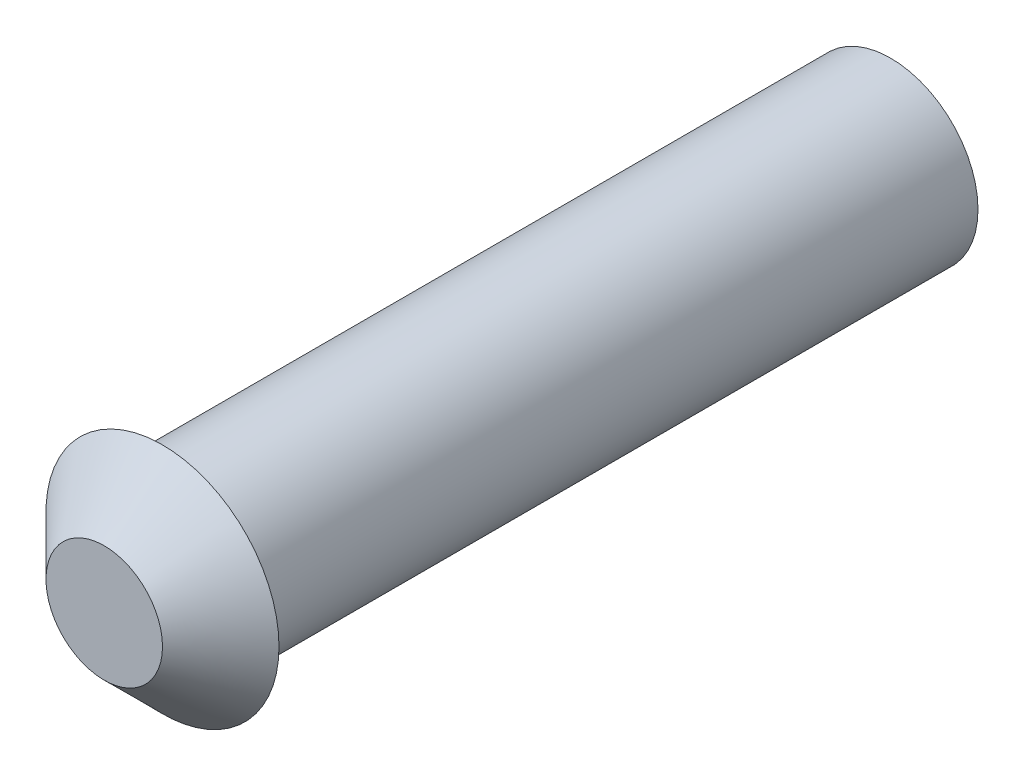
ISO-10303-21;
HEADER;
FILE_DESCRIPTION(('STEP AP214'),'2;1');
FILE_NAME('part.step','',(''),(''),'','','');
FILE_SCHEMA(('AUTOMOTIVE_DESIGN { 1 0 10303 214 1 1 1 1 }'));
ENDSEC;
DATA;
#1=APPLICATION_CONTEXT('core data for automotive mechanical design processes');
#2=APPLICATION_PROTOCOL_DEFINITION('international standard','automotive_design',2000,#1);
#3=PRODUCT_CONTEXT('',#1,'mechanical');
#4=PRODUCT('Part','Part','',(#3));
#5=PRODUCT_RELATED_PRODUCT_CATEGORY('part','',(#4));
#6=PRODUCT_DEFINITION_FORMATION('','',#4);
#7=PRODUCT_DEFINITION_CONTEXT('part definition',#1,'design');
#8=PRODUCT_DEFINITION('design','',#6,#7);
#9=PRODUCT_DEFINITION_SHAPE('','',#8);
#10=(LENGTH_UNIT() NAMED_UNIT(*) SI_UNIT(.MILLI.,.METRE.));
#11=(NAMED_UNIT(*) PLANE_ANGLE_UNIT() SI_UNIT($,.RADIAN.));
#12=(NAMED_UNIT(*) SI_UNIT($,.STERADIAN.) SOLID_ANGLE_UNIT());
#13=UNCERTAINTY_MEASURE_WITH_UNIT(LENGTH_MEASURE(1.E-05),#10,'distance_accuracy_value','');
#14=(GEOMETRIC_REPRESENTATION_CONTEXT(3) GLOBAL_UNCERTAINTY_ASSIGNED_CONTEXT((#13)) GLOBAL_UNIT_ASSIGNED_CONTEXT((#10,
#11,#12)) REPRESENTATION_CONTEXT('',''));
#15=CARTESIAN_POINT('',(0.,0.,0.));
#16=DIRECTION('',(0.,0.,1.));
#17=DIRECTION('',(1.,0.,0.));
#18=AXIS2_PLACEMENT_3D('',#15,#16,#17);
#19=CARTESIAN_POINT('',(0.,0.,7.9375));
#20=DIRECTION('',(0.,0.,-1.));
#21=DIRECTION('',(-1.,0.,0.));
#22=AXIS2_PLACEMENT_3D('',#19,#20,#21);
#23=CYLINDRICAL_SURFACE('',#22,1.905);
#24=CARTESIAN_POINT('',(0.,0.,7.9375));
#25=DIRECTION('',(0.,0.,1.));
#26=DIRECTION('',(1.,0.,0.));
#27=AXIS2_PLACEMENT_3D('',#24,#25,#26);
#28=CIRCLE('',#27,1.905);
#29=CARTESIAN_POINT('',(1.905,0.,7.9375));
#30=VERTEX_POINT('',#29);
#31=EDGE_CURVE('E11',#30,#30,#28,.T.);
#32=ORIENTED_EDGE('',*,*,#31,.F.);
#33=EDGE_LOOP('',(#32));
#34=FACE_BOUND('',#33,.T.);
#35=CARTESIAN_POINT('',(0.,0.,-7.9375));
#36=DIRECTION('',(0.,0.,1.));
#37=DIRECTION('',(1.,0.,0.));
#38=AXIS2_PLACEMENT_3D('',#35,#36,#37);
#39=CIRCLE('',#38,1.905);
#40=CARTESIAN_POINT('',(1.905,0.,-7.9375));
#41=VERTEX_POINT('',#40);
#42=EDGE_CURVE('E45',#41,#41,#39,.T.);
#43=ORIENTED_EDGE('',*,*,#42,.T.);
#44=EDGE_LOOP('',(#43));
#45=FACE_BOUND('',#44,.T.);
#46=ADVANCED_FACE('F42',(#34,#45),#23,.T.);
#47=CARTESIAN_POINT('',(0.,0.,-7.9375));
#48=DIRECTION('',(0.,0.,1.));
#49=DIRECTION('',(1.,0.,0.));
#50=AXIS2_PLACEMENT_3D('',#47,#48,#49);
#51=PLANE('',#50);
#52=ORIENTED_EDGE('',*,*,#42,.F.);
#53=EDGE_LOOP('',(#52));
#54=FACE_BOUND('',#53,.T.);
#55=ADVANCED_FACE('F74',(#54),#51,.F.);
#56=CARTESIAN_POINT('',(0.,0.,9.2075));
#57=DIRECTION('',(0.,0.,1.));
#58=DIRECTION('',(1.,0.,0.));
#59=AXIS2_PLACEMENT_3D('',#56,#57,#58);
#60=PLANE('',#59);
#61=CARTESIAN_POINT('',(0.,0.,9.2075));
#62=DIRECTION('',(0.,0.,1.));
#63=DIRECTION('',(1.,0.,0.));
#64=AXIS2_PLACEMENT_3D('',#61,#62,#63);
#65=CIRCLE('',#64,1.27);
#66=CARTESIAN_POINT('',(1.27,0.,9.2075));
#67=VERTEX_POINT('',#66);
#68=EDGE_CURVE('E52',#67,#67,#65,.T.);
#69=ORIENTED_EDGE('',*,*,#68,.T.);
#70=EDGE_LOOP('',(#69));
#71=FACE_BOUND('',#70,.T.);
#72=ADVANCED_FACE('F64',(#71),#60,.T.);
#73=CARTESIAN_POINT('',(0.,0.,7.9375));
#74=DIRECTION('',(0.,0.,1.));
#75=DIRECTION('',(1.,0.,0.));
#76=AXIS2_PLACEMENT_3D('',#73,#74,#75);
#77=PLANE('',#76);
#78=ORIENTED_EDGE('',*,*,#31,.T.);
#79=EDGE_LOOP('',(#78));
#80=FACE_BOUND('',#79,.T.);
#81=CARTESIAN_POINT('',(0.,0.,7.9375));
#82=DIRECTION('',(0.,0.,1.));
#83=DIRECTION('',(1.,0.,0.));
#84=AXIS2_PLACEMENT_3D('',#81,#82,#83);
#85=CIRCLE('',#84,2.54);
#86=CARTESIAN_POINT('',(2.54,0.,7.9375));
#87=VERTEX_POINT('',#86);
#88=EDGE_CURVE('E58',#87,#87,#85,.T.);
#89=ORIENTED_EDGE('',*,*,#88,.F.);
#90=EDGE_LOOP('',(#89));
#91=FACE_BOUND('',#90,.T.);
#92=ADVANCED_FACE('F73',(#80,#91),#77,.F.);
#93=CARTESIAN_POINT('',(0.,0.,9.2075));
#94=DIRECTION('',(0.,0.,-1.));
#95=DIRECTION('',(-1.,0.,0.));
#96=AXIS2_PLACEMENT_3D('',#93,#94,#95);
#97=CONICAL_SURFACE('',#96,1.27,0.785398163397448);
#98=ORIENTED_EDGE('',*,*,#88,.T.);
#99=EDGE_LOOP('',(#98));
#100=FACE_BOUND('',#99,.T.);
#101=ORIENTED_EDGE('',*,*,#68,.F.);
#102=EDGE_LOOP('',(#101));
#103=FACE_BOUND('',#102,.T.);
#104=ADVANCED_FACE('F76',(#100,#103),#97,.T.);
#105=CLOSED_SHELL('',(#46,#55,#72,#92,#104));
#106=MANIFOLD_SOLID_BREP('B2',#105);
#107=ADVANCED_BREP_SHAPE_REPRESENTATION('',(#18,#106),#14);
#108=SHAPE_DEFINITION_REPRESENTATION(#9,#107);
ENDSEC;
END-ISO-10303-21;
